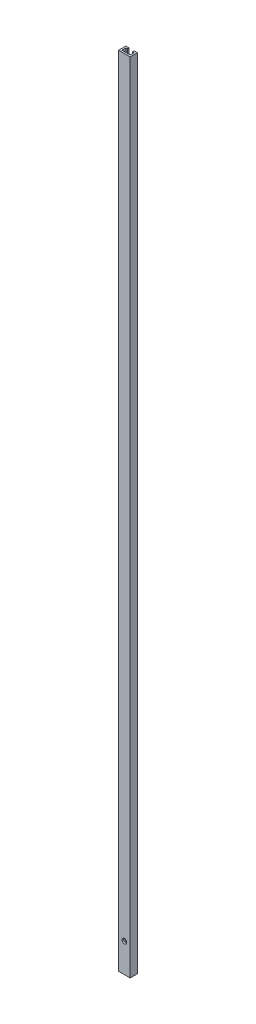
ISO-10303-21;
HEADER;
FILE_DESCRIPTION(('STEP AP214'),'2;1');
FILE_NAME('part.step','',(''),(''),'','','');
FILE_SCHEMA(('AUTOMOTIVE_DESIGN { 1 0 10303 214 1 1 1 1 }'));
ENDSEC;
DATA;
#1=APPLICATION_CONTEXT('core data for automotive mechanical design processes');
#2=APPLICATION_PROTOCOL_DEFINITION('international standard','automotive_design',2000,#1);
#3=PRODUCT_CONTEXT('',#1,'mechanical');
#4=PRODUCT('Part','Part','',(#3));
#5=PRODUCT_RELATED_PRODUCT_CATEGORY('part','',(#4));
#6=PRODUCT_DEFINITION_FORMATION('','',#4);
#7=PRODUCT_DEFINITION_CONTEXT('part definition',#1,'design');
#8=PRODUCT_DEFINITION('design','',#6,#7);
#9=PRODUCT_DEFINITION_SHAPE('','',#8);
#10=(LENGTH_UNIT() NAMED_UNIT(*) SI_UNIT(.MILLI.,.METRE.));
#11=(NAMED_UNIT(*) PLANE_ANGLE_UNIT() SI_UNIT($,.RADIAN.));
#12=(NAMED_UNIT(*) SI_UNIT($,.STERADIAN.) SOLID_ANGLE_UNIT());
#13=UNCERTAINTY_MEASURE_WITH_UNIT(LENGTH_MEASURE(1.E-05),#10,'distance_accuracy_value','');
#14=(GEOMETRIC_REPRESENTATION_CONTEXT(3) GLOBAL_UNCERTAINTY_ASSIGNED_CONTEXT((#13)) GLOBAL_UNIT_ASSIGNED_CONTEXT((#10,
#11,#12)) REPRESENTATION_CONTEXT('',''));
#15=CARTESIAN_POINT('',(0.,0.,0.));
#16=DIRECTION('',(0.,0.,1.));
#17=DIRECTION('',(1.,0.,0.));
#18=AXIS2_PLACEMENT_3D('',#15,#16,#17);
#19=CARTESIAN_POINT('',(0.,550.,0.));
#20=DIRECTION('',(1.,0.,0.));
#21=DIRECTION('',(0.,0.,-1.));
#22=AXIS2_PLACEMENT_3D('',#19,#20,#21);
#23=PLANE('',#22);
#24=DIRECTION('',(0.,0.,1.));
#25=VECTOR('',#24,1.);
#26=CARTESIAN_POINT('',(0.,0.,0.));
#27=LINE('',#26,#25);
#28=CARTESIAN_POINT('',(0.,0.,0.));
#29=VERTEX_POINT('',#28);
#30=CARTESIAN_POINT('',(0.,0.,5.));
#31=VERTEX_POINT('',#30);
#32=EDGE_CURVE('E164',#29,#31,#27,.T.);
#33=ORIENTED_EDGE('',*,*,#32,.T.);
#34=DIRECTION('',(0.,-1.,0.));
#35=VECTOR('',#34,1.);
#36=CARTESIAN_POINT('',(0.,550.,5.));
#37=LINE('',#36,#35);
#38=CARTESIAN_POINT('',(0.,550.,5.));
#39=VERTEX_POINT('',#38);
#40=EDGE_CURVE('E11',#39,#31,#37,.T.);
#41=ORIENTED_EDGE('',*,*,#40,.F.);
#42=DIRECTION('',(0.,0.,1.));
#43=VECTOR('',#42,1.);
#44=CARTESIAN_POINT('',(0.,550.,0.));
#45=LINE('',#44,#43);
#46=CARTESIAN_POINT('',(0.,550.,0.));
#47=VERTEX_POINT('',#46);
#48=EDGE_CURVE('E199',#47,#39,#45,.T.);
#49=ORIENTED_EDGE('',*,*,#48,.F.);
#50=DIRECTION('',(0.,-1.,0.));
#51=VECTOR('',#50,1.);
#52=CARTESIAN_POINT('',(0.,550.,0.));
#53=LINE('',#52,#51);
#54=EDGE_CURVE('E160',#47,#29,#53,.T.);
#55=ORIENTED_EDGE('',*,*,#54,.T.);
#56=EDGE_LOOP('',(#33,#41,#49,#55));
#57=FACE_BOUND('',#56,.T.);
#58=ADVANCED_FACE('F39',(#57),#23,.F.);
#59=CARTESIAN_POINT('',(0.,550.,5.));
#60=DIRECTION('',(0.,0.,-1.));
#61=DIRECTION('',(-1.,0.,0.));
#62=AXIS2_PLACEMENT_3D('',#59,#60,#61);
#63=PLANE('',#62);
#64=CARTESIAN_POINT('',(4.,20.,5.));
#65=DIRECTION('',(0.,0.,1.));
#66=DIRECTION('',(1.,0.,0.));
#67=AXIS2_PLACEMENT_3D('',#64,#65,#66);
#68=CIRCLE('',#67,1.6);
#69=CARTESIAN_POINT('',(5.6,20.,5.));
#70=VERTEX_POINT('',#69);
#71=EDGE_CURVE('E379',#70,#70,#68,.T.);
#72=ORIENTED_EDGE('',*,*,#71,.F.);
#73=EDGE_LOOP('',(#72));
#74=FACE_BOUND('',#73,.T.);
#75=DIRECTION('',(1.,0.,0.));
#76=VECTOR('',#75,1.);
#77=CARTESIAN_POINT('',(0.,0.,5.));
#78=LINE('',#77,#76);
#79=CARTESIAN_POINT('',(8.,0.,5.));
#80=VERTEX_POINT('',#79);
#81=EDGE_CURVE('E168',#31,#80,#78,.T.);
#82=ORIENTED_EDGE('',*,*,#81,.T.);
#83=DIRECTION('',(0.,-1.,0.));
#84=VECTOR('',#83,1.);
#85=CARTESIAN_POINT('',(8.,550.,5.));
#86=LINE('',#85,#84);
#87=CARTESIAN_POINT('',(8.,550.,5.));
#88=VERTEX_POINT('',#87);
#89=EDGE_CURVE('E48',#88,#80,#86,.T.);
#90=ORIENTED_EDGE('',*,*,#89,.F.);
#91=DIRECTION('',(1.,0.,0.));
#92=VECTOR('',#91,1.);
#93=CARTESIAN_POINT('',(0.,550.,5.));
#94=LINE('',#93,#92);
#95=EDGE_CURVE('E111',#39,#88,#94,.T.);
#96=ORIENTED_EDGE('',*,*,#95,.F.);
#97=ORIENTED_EDGE('',*,*,#40,.T.);
#98=EDGE_LOOP('',(#82,#90,#96,#97));
#99=FACE_BOUND('',#98,.T.);
#100=ADVANCED_FACE('F293',(#74,#99),#63,.F.);
#101=CARTESIAN_POINT('',(8.,550.,5.));
#102=DIRECTION('',(-1.,0.,0.));
#103=DIRECTION('',(0.,0.,1.));
#104=AXIS2_PLACEMENT_3D('',#101,#102,#103);
#105=PLANE('',#104);
#106=DIRECTION('',(0.,0.,-1.));
#107=VECTOR('',#106,1.);
#108=CARTESIAN_POINT('',(8.,0.,5.));
#109=LINE('',#108,#107);
#110=CARTESIAN_POINT('',(8.,0.,0.));
#111=VERTEX_POINT('',#110);
#112=EDGE_CURVE('E172',#80,#111,#109,.T.);
#113=ORIENTED_EDGE('',*,*,#112,.T.);
#114=DIRECTION('',(0.,-1.,0.));
#115=VECTOR('',#114,1.);
#116=CARTESIAN_POINT('',(8.,550.,0.));
#117=LINE('',#116,#115);
#118=CARTESIAN_POINT('',(8.,550.,0.));
#119=VERTEX_POINT('',#118);
#120=EDGE_CURVE('E226',#119,#111,#117,.T.);
#121=ORIENTED_EDGE('',*,*,#120,.F.);
#122=DIRECTION('',(0.,0.,-1.));
#123=VECTOR('',#122,1.);
#124=CARTESIAN_POINT('',(8.,550.,5.));
#125=LINE('',#124,#123);
#126=EDGE_CURVE('E236',#88,#119,#125,.T.);
#127=ORIENTED_EDGE('',*,*,#126,.F.);
#128=ORIENTED_EDGE('',*,*,#89,.T.);
#129=EDGE_LOOP('',(#113,#121,#127,#128));
#130=FACE_BOUND('',#129,.T.);
#131=ADVANCED_FACE('F234',(#130),#105,.F.);
#132=CARTESIAN_POINT('',(8.,550.,0.));
#133=DIRECTION('',(0.,0.,1.));
#134=DIRECTION('',(1.,0.,0.));
#135=AXIS2_PLACEMENT_3D('',#132,#133,#134);
#136=PLANE('',#135);
#137=DIRECTION('',(-1.,0.,0.));
#138=VECTOR('',#137,1.);
#139=CARTESIAN_POINT('',(8.,0.,0.));
#140=LINE('',#139,#138);
#141=CARTESIAN_POINT('',(5.75,0.,0.));
#142=VERTEX_POINT('',#141);
#143=EDGE_CURVE('E175',#111,#142,#140,.T.);
#144=ORIENTED_EDGE('',*,*,#143,.T.);
#145=DIRECTION('',(0.,-1.,0.));
#146=VECTOR('',#145,1.);
#147=CARTESIAN_POINT('',(5.75,550.,0.));
#148=LINE('',#147,#146);
#149=CARTESIAN_POINT('',(5.75,550.,0.));
#150=VERTEX_POINT('',#149);
#151=EDGE_CURVE('E222',#150,#142,#148,.T.);
#152=ORIENTED_EDGE('',*,*,#151,.F.);
#153=DIRECTION('',(-1.,0.,0.));
#154=VECTOR('',#153,1.);
#155=CARTESIAN_POINT('',(8.,550.,0.));
#156=LINE('',#155,#154);
#157=EDGE_CURVE('E255',#119,#150,#156,.T.);
#158=ORIENTED_EDGE('',*,*,#157,.F.);
#159=ORIENTED_EDGE('',*,*,#120,.T.);
#160=EDGE_LOOP('',(#144,#152,#158,#159));
#161=FACE_BOUND('',#160,.T.);
#162=ADVANCED_FACE('F245',(#161),#136,.F.);
#163=CARTESIAN_POINT('',(5.75,550.,0.));
#164=DIRECTION('',(1.,0.,0.));
#165=DIRECTION('',(0.,0.,-1.));
#166=AXIS2_PLACEMENT_3D('',#163,#164,#165);
#167=PLANE('',#166);
#168=DIRECTION('',(0.,0.,1.));
#169=VECTOR('',#168,1.);
#170=CARTESIAN_POINT('',(5.75,0.,0.));
#171=LINE('',#170,#169);
#172=CARTESIAN_POINT('',(5.75,0.,1.15));
#173=VERTEX_POINT('',#172);
#174=EDGE_CURVE('E178',#142,#173,#171,.T.);
#175=ORIENTED_EDGE('',*,*,#174,.T.);
#176=DIRECTION('',(0.,-1.,0.));
#177=VECTOR('',#176,1.);
#178=CARTESIAN_POINT('',(5.75,550.,1.15));
#179=LINE('',#178,#177);
#180=CARTESIAN_POINT('',(5.75,550.,1.15));
#181=VERTEX_POINT('',#180);
#182=EDGE_CURVE('E218',#181,#173,#179,.T.);
#183=ORIENTED_EDGE('',*,*,#182,.F.);
#184=DIRECTION('',(0.,0.,1.));
#185=VECTOR('',#184,1.);
#186=CARTESIAN_POINT('',(5.75,550.,0.));
#187=LINE('',#186,#185);
#188=EDGE_CURVE('E251',#150,#181,#187,.T.);
#189=ORIENTED_EDGE('',*,*,#188,.F.);
#190=ORIENTED_EDGE('',*,*,#151,.T.);
#191=EDGE_LOOP('',(#175,#183,#189,#190));
#192=FACE_BOUND('',#191,.T.);
#193=ADVANCED_FACE('F249',(#192),#167,.F.);
#194=CARTESIAN_POINT('',(5.75,550.,1.15));
#195=DIRECTION('',(0.,0.,-1.));
#196=DIRECTION('',(-1.,0.,0.));
#197=AXIS2_PLACEMENT_3D('',#194,#195,#196);
#198=PLANE('',#197);
#199=DIRECTION('',(1.,0.,0.));
#200=VECTOR('',#199,1.);
#201=CARTESIAN_POINT('',(5.75,0.,1.15));
#202=LINE('',#201,#200);
#203=CARTESIAN_POINT('',(6.85,0.,1.15));
#204=VERTEX_POINT('',#203);
#205=EDGE_CURVE('E181',#173,#204,#202,.T.);
#206=ORIENTED_EDGE('',*,*,#205,.T.);
#207=DIRECTION('',(0.,-1.,0.));
#208=VECTOR('',#207,1.);
#209=CARTESIAN_POINT('',(6.85,550.,1.15));
#210=LINE('',#209,#208);
#211=CARTESIAN_POINT('',(6.85,550.,1.15));
#212=VERTEX_POINT('',#211);
#213=EDGE_CURVE('E214',#212,#204,#210,.T.);
#214=ORIENTED_EDGE('',*,*,#213,.F.);
#215=DIRECTION('',(1.,0.,0.));
#216=VECTOR('',#215,1.);
#217=CARTESIAN_POINT('',(5.75,550.,1.15));
#218=LINE('',#217,#216);
#219=EDGE_CURVE('E254',#181,#212,#218,.T.);
#220=ORIENTED_EDGE('',*,*,#219,.F.);
#221=ORIENTED_EDGE('',*,*,#182,.T.);
#222=EDGE_LOOP('',(#206,#214,#220,#221));
#223=FACE_BOUND('',#222,.T.);
#224=ADVANCED_FACE('F308',(#223),#198,.F.);
#225=CARTESIAN_POINT('',(6.85,550.,1.15));
#226=DIRECTION('',(1.,0.,0.));
#227=DIRECTION('',(0.,0.,-1.));
#228=AXIS2_PLACEMENT_3D('',#225,#226,#227);
#229=PLANE('',#228);
#230=DIRECTION('',(0.,0.,1.));
#231=VECTOR('',#230,1.);
#232=CARTESIAN_POINT('',(6.85,0.,1.15));
#233=LINE('',#232,#231);
#234=CARTESIAN_POINT('',(6.85,0.,3.85));
#235=VERTEX_POINT('',#234);
#236=EDGE_CURVE('E184',#204,#235,#233,.T.);
#237=ORIENTED_EDGE('',*,*,#236,.T.);
#238=DIRECTION('',(0.,-1.,0.));
#239=VECTOR('',#238,1.);
#240=CARTESIAN_POINT('',(6.85,550.,3.85));
#241=LINE('',#240,#239);
#242=CARTESIAN_POINT('',(6.85,550.,3.85));
#243=VERTEX_POINT('',#242);
#244=EDGE_CURVE('E210',#243,#235,#241,.T.);
#245=ORIENTED_EDGE('',*,*,#244,.F.);
#246=DIRECTION('',(0.,0.,1.));
#247=VECTOR('',#246,1.);
#248=CARTESIAN_POINT('',(6.85,550.,1.15));
#249=LINE('',#248,#247);
#250=EDGE_CURVE('E259',#212,#243,#249,.T.);
#251=ORIENTED_EDGE('',*,*,#250,.F.);
#252=ORIENTED_EDGE('',*,*,#213,.T.);
#253=EDGE_LOOP('',(#237,#245,#251,#252));
#254=FACE_BOUND('',#253,.T.);
#255=ADVANCED_FACE('F311',(#254),#229,.F.);
#256=CARTESIAN_POINT('',(6.85,550.,3.85));
#257=DIRECTION('',(0.,0.,1.));
#258=DIRECTION('',(1.,0.,0.));
#259=AXIS2_PLACEMENT_3D('',#256,#257,#258);
#260=PLANE('',#259);
#261=CARTESIAN_POINT('',(4.,20.,3.85));
#262=DIRECTION('',(0.,0.,1.));
#263=DIRECTION('',(1.,0.,0.));
#264=AXIS2_PLACEMENT_3D('',#261,#262,#263);
#265=CIRCLE('',#264,1.6);
#266=CARTESIAN_POINT('',(5.6,20.,3.85));
#267=VERTEX_POINT('',#266);
#268=EDGE_CURVE('E169',#267,#267,#265,.F.);
#269=ORIENTED_EDGE('',*,*,#268,.F.);
#270=EDGE_LOOP('',(#269));
#271=FACE_BOUND('',#270,.T.);
#272=DIRECTION('',(-1.,0.,0.));
#273=VECTOR('',#272,1.);
#274=CARTESIAN_POINT('',(6.85,0.,3.85));
#275=LINE('',#274,#273);
#276=CARTESIAN_POINT('',(1.15,0.,3.85));
#277=VERTEX_POINT('',#276);
#278=EDGE_CURVE('E187',#235,#277,#275,.T.);
#279=ORIENTED_EDGE('',*,*,#278,.T.);
#280=DIRECTION('',(0.,-1.,0.));
#281=VECTOR('',#280,1.);
#282=CARTESIAN_POINT('',(1.15,550.,3.85));
#283=LINE('',#282,#281);
#284=CARTESIAN_POINT('',(1.15,550.,3.85));
#285=VERTEX_POINT('',#284);
#286=EDGE_CURVE('E206',#285,#277,#283,.T.);
#287=ORIENTED_EDGE('',*,*,#286,.F.);
#288=DIRECTION('',(-1.,0.,0.));
#289=VECTOR('',#288,1.);
#290=CARTESIAN_POINT('',(6.85,550.,3.85));
#291=LINE('',#290,#289);
#292=EDGE_CURVE('E266',#243,#285,#291,.T.);
#293=ORIENTED_EDGE('',*,*,#292,.F.);
#294=ORIENTED_EDGE('',*,*,#244,.T.);
#295=EDGE_LOOP('',(#279,#287,#293,#294));
#296=FACE_BOUND('',#295,.T.);
#297=ADVANCED_FACE('F274',(#271,#296),#260,.F.);
#298=CARTESIAN_POINT('',(1.15,550.,3.85));
#299=DIRECTION('',(-1.,0.,0.));
#300=DIRECTION('',(0.,0.,1.));
#301=AXIS2_PLACEMENT_3D('',#298,#299,#300);
#302=PLANE('',#301);
#303=DIRECTION('',(0.,0.,-1.));
#304=VECTOR('',#303,1.);
#305=CARTESIAN_POINT('',(1.15,0.,3.85));
#306=LINE('',#305,#304);
#307=CARTESIAN_POINT('',(1.15,0.,1.15));
#308=VERTEX_POINT('',#307);
#309=EDGE_CURVE('E190',#277,#308,#306,.T.);
#310=ORIENTED_EDGE('',*,*,#309,.T.);
#311=DIRECTION('',(0.,-1.,0.));
#312=VECTOR('',#311,1.);
#313=CARTESIAN_POINT('',(1.15,550.,1.15));
#314=LINE('',#313,#312);
#315=CARTESIAN_POINT('',(1.15,550.,1.15));
#316=VERTEX_POINT('',#315);
#317=EDGE_CURVE('E153',#316,#308,#314,.T.);
#318=ORIENTED_EDGE('',*,*,#317,.F.);
#319=DIRECTION('',(0.,0.,-1.));
#320=VECTOR('',#319,1.);
#321=CARTESIAN_POINT('',(1.15,550.,3.85));
#322=LINE('',#321,#320);
#323=EDGE_CURVE('E142',#285,#316,#322,.T.);
#324=ORIENTED_EDGE('',*,*,#323,.F.);
#325=ORIENTED_EDGE('',*,*,#286,.T.);
#326=EDGE_LOOP('',(#310,#318,#324,#325));
#327=FACE_BOUND('',#326,.T.);
#328=ADVANCED_FACE('F278',(#327),#302,.F.);
#329=CARTESIAN_POINT('',(1.15,550.,1.15));
#330=DIRECTION('',(0.,0.,-1.));
#331=DIRECTION('',(-1.,0.,0.));
#332=AXIS2_PLACEMENT_3D('',#329,#330,#331);
#333=PLANE('',#332);
#334=DIRECTION('',(1.,0.,0.));
#335=VECTOR('',#334,1.);
#336=CARTESIAN_POINT('',(1.15,0.,1.15));
#337=LINE('',#336,#335);
#338=CARTESIAN_POINT('',(2.25,0.,1.15));
#339=VERTEX_POINT('',#338);
#340=EDGE_CURVE('E151',#308,#339,#337,.T.);
#341=ORIENTED_EDGE('',*,*,#340,.T.);
#342=DIRECTION('',(0.,-1.,0.));
#343=VECTOR('',#342,1.);
#344=CARTESIAN_POINT('',(2.25,550.,1.15));
#345=LINE('',#344,#343);
#346=CARTESIAN_POINT('',(2.25,550.,1.15));
#347=VERTEX_POINT('',#346);
#348=EDGE_CURVE('E148',#347,#339,#345,.T.);
#349=ORIENTED_EDGE('',*,*,#348,.F.);
#350=DIRECTION('',(1.,0.,0.));
#351=VECTOR('',#350,1.);
#352=CARTESIAN_POINT('',(1.15,550.,1.15));
#353=LINE('',#352,#351);
#354=EDGE_CURVE('E136',#316,#347,#353,.T.);
#355=ORIENTED_EDGE('',*,*,#354,.F.);
#356=ORIENTED_EDGE('',*,*,#317,.T.);
#357=EDGE_LOOP('',(#341,#349,#355,#356));
#358=FACE_BOUND('',#357,.T.);
#359=ADVANCED_FACE('F149',(#358),#333,.F.);
#360=CARTESIAN_POINT('',(2.25,550.,1.15));
#361=DIRECTION('',(-1.,0.,0.));
#362=DIRECTION('',(0.,0.,1.));
#363=AXIS2_PLACEMENT_3D('',#360,#361,#362);
#364=PLANE('',#363);
#365=DIRECTION('',(0.,0.,-1.));
#366=VECTOR('',#365,1.);
#367=CARTESIAN_POINT('',(2.25,0.,1.15));
#368=LINE('',#367,#366);
#369=CARTESIAN_POINT('',(2.25,0.,0.));
#370=VERTEX_POINT('',#369);
#371=EDGE_CURVE('E97',#339,#370,#368,.T.);
#372=ORIENTED_EDGE('',*,*,#371,.T.);
#373=DIRECTION('',(0.,-1.,0.));
#374=VECTOR('',#373,1.);
#375=CARTESIAN_POINT('',(2.25,550.,0.));
#376=LINE('',#375,#374);
#377=CARTESIAN_POINT('',(2.25,550.,0.));
#378=VERTEX_POINT('',#377);
#379=EDGE_CURVE('E154',#378,#370,#376,.T.);
#380=ORIENTED_EDGE('',*,*,#379,.F.);
#381=DIRECTION('',(0.,0.,-1.));
#382=VECTOR('',#381,1.);
#383=CARTESIAN_POINT('',(2.25,550.,1.15));
#384=LINE('',#383,#382);
#385=EDGE_CURVE('E140',#347,#378,#384,.T.);
#386=ORIENTED_EDGE('',*,*,#385,.F.);
#387=ORIENTED_EDGE('',*,*,#348,.T.);
#388=EDGE_LOOP('',(#372,#380,#386,#387));
#389=FACE_BOUND('',#388,.T.);
#390=ADVANCED_FACE('F156',(#389),#364,.F.);
#391=CARTESIAN_POINT('',(2.25,550.,0.));
#392=DIRECTION('',(0.,0.,1.));
#393=DIRECTION('',(1.,0.,0.));
#394=AXIS2_PLACEMENT_3D('',#391,#392,#393);
#395=PLANE('',#394);
#396=DIRECTION('',(-1.,0.,0.));
#397=VECTOR('',#396,1.);
#398=CARTESIAN_POINT('',(2.25,0.,0.));
#399=LINE('',#398,#397);
#400=EDGE_CURVE('E103',#370,#29,#399,.T.);
#401=ORIENTED_EDGE('',*,*,#400,.T.);
#402=ORIENTED_EDGE('',*,*,#54,.F.);
#403=DIRECTION('',(-1.,0.,0.));
#404=VECTOR('',#403,1.);
#405=CARTESIAN_POINT('',(2.25,550.,0.));
#406=LINE('',#405,#404);
#407=EDGE_CURVE('E56',#378,#47,#406,.T.);
#408=ORIENTED_EDGE('',*,*,#407,.F.);
#409=ORIENTED_EDGE('',*,*,#379,.T.);
#410=EDGE_LOOP('',(#401,#402,#408,#409));
#411=FACE_BOUND('',#410,.T.);
#412=ADVANCED_FACE('F282',(#411),#395,.F.);
#413=CARTESIAN_POINT('',(0.,550.,0.));
#414=DIRECTION('',(0.,1.,0.));
#415=DIRECTION('',(0.,0.,1.));
#416=AXIS2_PLACEMENT_3D('',#413,#414,#415);
#417=PLANE('',#416);
#418=ORIENTED_EDGE('',*,*,#48,.T.);
#419=ORIENTED_EDGE('',*,*,#95,.T.);
#420=ORIENTED_EDGE('',*,*,#126,.T.);
#421=ORIENTED_EDGE('',*,*,#157,.T.);
#422=ORIENTED_EDGE('',*,*,#188,.T.);
#423=ORIENTED_EDGE('',*,*,#219,.T.);
#424=ORIENTED_EDGE('',*,*,#250,.T.);
#425=ORIENTED_EDGE('',*,*,#292,.T.);
#426=ORIENTED_EDGE('',*,*,#323,.T.);
#427=ORIENTED_EDGE('',*,*,#354,.T.);
#428=ORIENTED_EDGE('',*,*,#385,.T.);
#429=ORIENTED_EDGE('',*,*,#407,.T.);
#430=EDGE_LOOP('',(#418,#419,#420,#421,#422,#423,#424,#425,#426,#427,#428,#429));
#431=FACE_BOUND('',#430,.T.);
#432=ADVANCED_FACE('F138',(#431),#417,.T.);
#433=CARTESIAN_POINT('',(0.,0.,0.));
#434=DIRECTION('',(0.,1.,0.));
#435=DIRECTION('',(0.,0.,1.));
#436=AXIS2_PLACEMENT_3D('',#433,#434,#435);
#437=PLANE('',#436);
#438=ORIENTED_EDGE('',*,*,#32,.F.);
#439=ORIENTED_EDGE('',*,*,#400,.F.);
#440=ORIENTED_EDGE('',*,*,#371,.F.);
#441=ORIENTED_EDGE('',*,*,#340,.F.);
#442=ORIENTED_EDGE('',*,*,#309,.F.);
#443=ORIENTED_EDGE('',*,*,#278,.F.);
#444=ORIENTED_EDGE('',*,*,#236,.F.);
#445=ORIENTED_EDGE('',*,*,#205,.F.);
#446=ORIENTED_EDGE('',*,*,#174,.F.);
#447=ORIENTED_EDGE('',*,*,#143,.F.);
#448=ORIENTED_EDGE('',*,*,#112,.F.);
#449=ORIENTED_EDGE('',*,*,#81,.F.);
#450=EDGE_LOOP('',(#438,#439,#440,#441,#442,#443,#444,#445,#446,#447,#448,#449));
#451=FACE_BOUND('',#450,.T.);
#452=ADVANCED_FACE('F240',(#451),#437,.F.);
#453=CARTESIAN_POINT('',(4.,20.,-0.675483399593915));
#454=DIRECTION('',(0.,0.,1.));
#455=DIRECTION('',(1.,0.,0.));
#456=AXIS2_PLACEMENT_3D('',#453,#454,#455);
#457=CYLINDRICAL_SURFACE('',#456,1.6);
#458=ORIENTED_EDGE('',*,*,#268,.T.);
#459=EDGE_LOOP('',(#458));
#460=FACE_BOUND('',#459,.T.);
#461=ORIENTED_EDGE('',*,*,#71,.T.);
#462=EDGE_LOOP('',(#461));
#463=FACE_BOUND('',#462,.T.);
#464=ADVANCED_FACE('F348',(#460,#463),#457,.F.);
#465=CLOSED_SHELL('',(#58,#100,#131,#162,#193,#224,#255,#297,#328,#359,#390,#412,#432,#452,#464));
#466=MANIFOLD_SOLID_BREP('B2',#465);
#467=ADVANCED_BREP_SHAPE_REPRESENTATION('',(#18,#466),#14);
#468=SHAPE_DEFINITION_REPRESENTATION(#9,#467);
ENDSEC;
END-ISO-10303-21;
